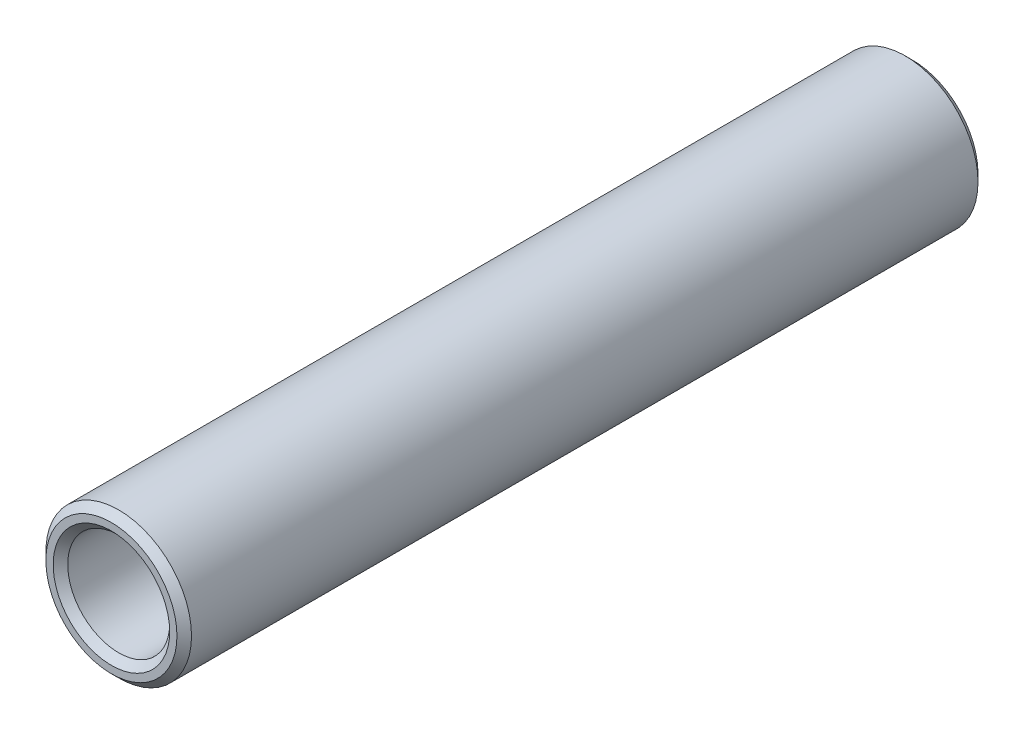
ISO-10303-21;
HEADER;
FILE_DESCRIPTION(('STEP AP214'),'2;1');
FILE_NAME('part.step','',(''),(''),'','','');
FILE_SCHEMA(('AUTOMOTIVE_DESIGN { 1 0 10303 214 1 1 1 1 }'));
ENDSEC;
DATA;
#1=APPLICATION_CONTEXT('core data for automotive mechanical design processes');
#2=APPLICATION_PROTOCOL_DEFINITION('international standard','automotive_design',2000,#1);
#3=PRODUCT_CONTEXT('',#1,'mechanical');
#4=PRODUCT('Part','Part','',(#3));
#5=PRODUCT_RELATED_PRODUCT_CATEGORY('part','',(#4));
#6=PRODUCT_DEFINITION_FORMATION('','',#4);
#7=PRODUCT_DEFINITION_CONTEXT('part definition',#1,'design');
#8=PRODUCT_DEFINITION('design','',#6,#7);
#9=PRODUCT_DEFINITION_SHAPE('','',#8);
#10=(LENGTH_UNIT() NAMED_UNIT(*) SI_UNIT(.MILLI.,.METRE.));
#11=(NAMED_UNIT(*) PLANE_ANGLE_UNIT() SI_UNIT($,.RADIAN.));
#12=(NAMED_UNIT(*) SI_UNIT($,.STERADIAN.) SOLID_ANGLE_UNIT());
#13=UNCERTAINTY_MEASURE_WITH_UNIT(LENGTH_MEASURE(1.E-05),#10,'distance_accuracy_value','');
#14=(GEOMETRIC_REPRESENTATION_CONTEXT(3) GLOBAL_UNCERTAINTY_ASSIGNED_CONTEXT((#13)) GLOBAL_UNIT_ASSIGNED_CONTEXT((#10,
#11,#12)) REPRESENTATION_CONTEXT('',''));
#15=CARTESIAN_POINT('',(0.,0.,0.));
#16=DIRECTION('',(0.,0.,1.));
#17=DIRECTION('',(1.,0.,0.));
#18=AXIS2_PLACEMENT_3D('',#15,#16,#17);
#19=CARTESIAN_POINT('',(0.,0.,55.));
#20=DIRECTION('',(0.,0.,1.));
#21=DIRECTION('',(1.,0.,0.));
#22=AXIS2_PLACEMENT_3D('',#19,#20,#21);
#23=PLANE('',#22);
#24=CARTESIAN_POINT('',(0.,0.,55.));
#25=DIRECTION('',(0.,0.,1.));
#26=DIRECTION('',(1.,0.,0.));
#27=AXIS2_PLACEMENT_3D('',#24,#25,#26);
#28=CIRCLE('',#27,4.49999999999998);
#29=CARTESIAN_POINT('',(4.49999999999998,0.,55.));
#30=VERTEX_POINT('',#29);
#31=EDGE_CURVE('E10',#30,#30,#28,.T.);
#32=ORIENTED_EDGE('',*,*,#31,.T.);
#33=EDGE_LOOP('',(#32));
#34=FACE_BOUND('',#33,.T.);
#35=CARTESIAN_POINT('',(0.,0.,55.));
#36=DIRECTION('',(0.,0.,1.));
#37=DIRECTION('',(1.,0.,0.));
#38=AXIS2_PLACEMENT_3D('',#35,#36,#37);
#39=CIRCLE('',#38,4.);
#40=CARTESIAN_POINT('',(4.,0.,55.));
#41=VERTEX_POINT('',#40);
#42=EDGE_CURVE('E38',#41,#41,#39,.F.);
#43=ORIENTED_EDGE('',*,*,#42,.T.);
#44=EDGE_LOOP('',(#43));
#45=FACE_BOUND('',#44,.T.);
#46=ADVANCED_FACE('F31',(#34,#45),#23,.T.);
#47=CARTESIAN_POINT('',(0.,0.,0.));
#48=DIRECTION('',(0.,0.,1.));
#49=DIRECTION('',(1.,0.,0.));
#50=AXIS2_PLACEMENT_3D('',#47,#48,#49);
#51=PLANE('',#50);
#52=CARTESIAN_POINT('',(0.,0.,0.));
#53=DIRECTION('',(0.,0.,1.));
#54=DIRECTION('',(1.,0.,0.));
#55=AXIS2_PLACEMENT_3D('',#52,#53,#54);
#56=CIRCLE('',#55,4.);
#57=CARTESIAN_POINT('',(4.,0.,0.));
#58=VERTEX_POINT('',#57);
#59=EDGE_CURVE('E57',#58,#58,#56,.T.);
#60=ORIENTED_EDGE('',*,*,#59,.T.);
#61=EDGE_LOOP('',(#60));
#62=FACE_BOUND('',#61,.T.);
#63=CARTESIAN_POINT('',(0.,0.,0.));
#64=DIRECTION('',(0.,0.,1.));
#65=DIRECTION('',(1.,0.,0.));
#66=AXIS2_PLACEMENT_3D('',#63,#64,#65);
#67=CIRCLE('',#66,4.5);
#68=CARTESIAN_POINT('',(4.5,0.,0.));
#69=VERTEX_POINT('',#68);
#70=EDGE_CURVE('E60',#69,#69,#67,.F.);
#71=ORIENTED_EDGE('',*,*,#70,.T.);
#72=EDGE_LOOP('',(#71));
#73=FACE_BOUND('',#72,.T.);
#74=ADVANCED_FACE('F64',(#62,#73),#51,.F.);
#75=CARTESIAN_POINT('',(0.,0.,55.));
#76=DIRECTION('',(0.,0.,-1.));
#77=DIRECTION('',(-1.,0.,0.));
#78=AXIS2_PLACEMENT_3D('',#75,#76,#77);
#79=CYLINDRICAL_SURFACE('',#78,5.);
#80=CARTESIAN_POINT('',(0.,0.,0.499999999999994));
#81=DIRECTION('',(0.,0.,1.));
#82=DIRECTION('',(1.,0.,0.));
#83=AXIS2_PLACEMENT_3D('',#80,#81,#82);
#84=CIRCLE('',#83,5.);
#85=CARTESIAN_POINT('',(5.,0.,0.499999999999994));
#86=VERTEX_POINT('',#85);
#87=EDGE_CURVE('E42',#86,#86,#84,.T.);
#88=ORIENTED_EDGE('',*,*,#87,.T.);
#89=EDGE_LOOP('',(#88));
#90=FACE_BOUND('',#89,.T.);
#91=CARTESIAN_POINT('',(0.,0.,54.5));
#92=DIRECTION('',(0.,0.,1.));
#93=DIRECTION('',(1.,0.,0.));
#94=AXIS2_PLACEMENT_3D('',#91,#92,#93);
#95=CIRCLE('',#94,5.);
#96=CARTESIAN_POINT('',(5.,0.,54.5));
#97=VERTEX_POINT('',#96);
#98=EDGE_CURVE('E46',#97,#97,#95,.F.);
#99=ORIENTED_EDGE('',*,*,#98,.T.);
#100=EDGE_LOOP('',(#99));
#101=FACE_BOUND('',#100,.T.);
#102=ADVANCED_FACE('F74',(#90,#101),#79,.T.);
#103=CARTESIAN_POINT('',(0.,0.,55.));
#104=DIRECTION('',(0.,0.,-1.));
#105=DIRECTION('',(-1.,0.,0.));
#106=AXIS2_PLACEMENT_3D('',#103,#104,#105);
#107=CYLINDRICAL_SURFACE('',#106,3.5);
#108=CARTESIAN_POINT('',(0.,0.,0.5));
#109=DIRECTION('',(0.,0.,1.));
#110=DIRECTION('',(1.,0.,0.));
#111=AXIS2_PLACEMENT_3D('',#108,#109,#110);
#112=CIRCLE('',#111,3.5);
#113=CARTESIAN_POINT('',(3.5,0.,0.5));
#114=VERTEX_POINT('',#113);
#115=EDGE_CURVE('E51',#114,#114,#112,.F.);
#116=ORIENTED_EDGE('',*,*,#115,.T.);
#117=EDGE_LOOP('',(#116));
#118=FACE_BOUND('',#117,.T.);
#119=CARTESIAN_POINT('',(0.,0.,54.5));
#120=DIRECTION('',(0.,0.,1.));
#121=DIRECTION('',(1.,0.,0.));
#122=AXIS2_PLACEMENT_3D('',#119,#120,#121);
#123=CIRCLE('',#122,3.5);
#124=CARTESIAN_POINT('',(3.5,0.,54.5));
#125=VERTEX_POINT('',#124);
#126=EDGE_CURVE('E54',#125,#125,#123,.T.);
#127=ORIENTED_EDGE('',*,*,#126,.T.);
#128=EDGE_LOOP('',(#127));
#129=FACE_BOUND('',#128,.T.);
#130=ADVANCED_FACE('F77',(#118,#129),#107,.F.);
#131=CARTESIAN_POINT('',(0.,0.,0.));
#132=DIRECTION('',(0.,0.,-1.));
#133=DIRECTION('',(-1.,0.,0.));
#134=AXIS2_PLACEMENT_3D('',#131,#132,#133);
#135=CONICAL_SURFACE('',#134,4.,0.785398163397444);
#136=ORIENTED_EDGE('',*,*,#115,.F.);
#137=EDGE_LOOP('',(#136));
#138=FACE_BOUND('',#137,.T.);
#139=ORIENTED_EDGE('',*,*,#59,.F.);
#140=EDGE_LOOP('',(#139));
#141=FACE_BOUND('',#140,.T.);
#142=ADVANCED_FACE('F70',(#138,#141),#135,.F.);
#143=CARTESIAN_POINT('',(0.,0.,0.499999999999994));
#144=DIRECTION('',(0.,0.,1.));
#145=DIRECTION('',(1.,0.,0.));
#146=AXIS2_PLACEMENT_3D('',#143,#144,#145);
#147=CONICAL_SURFACE('',#146,5.,0.785398163397451);
#148=ORIENTED_EDGE('',*,*,#70,.F.);
#149=EDGE_LOOP('',(#148));
#150=FACE_BOUND('',#149,.T.);
#151=ORIENTED_EDGE('',*,*,#87,.F.);
#152=EDGE_LOOP('',(#151));
#153=FACE_BOUND('',#152,.T.);
#154=ADVANCED_FACE('F66',(#150,#153),#147,.T.);
#155=CARTESIAN_POINT('',(0.,0.,55.));
#156=DIRECTION('',(0.,0.,-1.));
#157=DIRECTION('',(-1.,0.,0.));
#158=AXIS2_PLACEMENT_3D('',#155,#156,#157);
#159=CONICAL_SURFACE('',#158,4.49999999999998,0.785398163397444);
#160=ORIENTED_EDGE('',*,*,#98,.F.);
#161=EDGE_LOOP('',(#160));
#162=FACE_BOUND('',#161,.T.);
#163=ORIENTED_EDGE('',*,*,#31,.F.);
#164=EDGE_LOOP('',(#163));
#165=FACE_BOUND('',#164,.T.);
#166=ADVANCED_FACE('F69',(#162,#165),#159,.T.);
#167=CARTESIAN_POINT('',(0.,0.,54.5));
#168=DIRECTION('',(0.,0.,1.));
#169=DIRECTION('',(1.,0.,0.));
#170=AXIS2_PLACEMENT_3D('',#167,#168,#169);
#171=CONICAL_SURFACE('',#170,3.5,0.785398163397444);
#172=ORIENTED_EDGE('',*,*,#42,.F.);
#173=EDGE_LOOP('',(#172));
#174=FACE_BOUND('',#173,.T.);
#175=ORIENTED_EDGE('',*,*,#126,.F.);
#176=EDGE_LOOP('',(#175));
#177=FACE_BOUND('',#176,.T.);
#178=ADVANCED_FACE('F33',(#174,#177),#171,.F.);
#179=CLOSED_SHELL('',(#46,#74,#102,#130,#142,#154,#166,#178));
#180=MANIFOLD_SOLID_BREP('B2',#179);
#181=ADVANCED_BREP_SHAPE_REPRESENTATION('',(#18,#180),#14);
#182=SHAPE_DEFINITION_REPRESENTATION(#9,#181);
ENDSEC;
END-ISO-10303-21;
